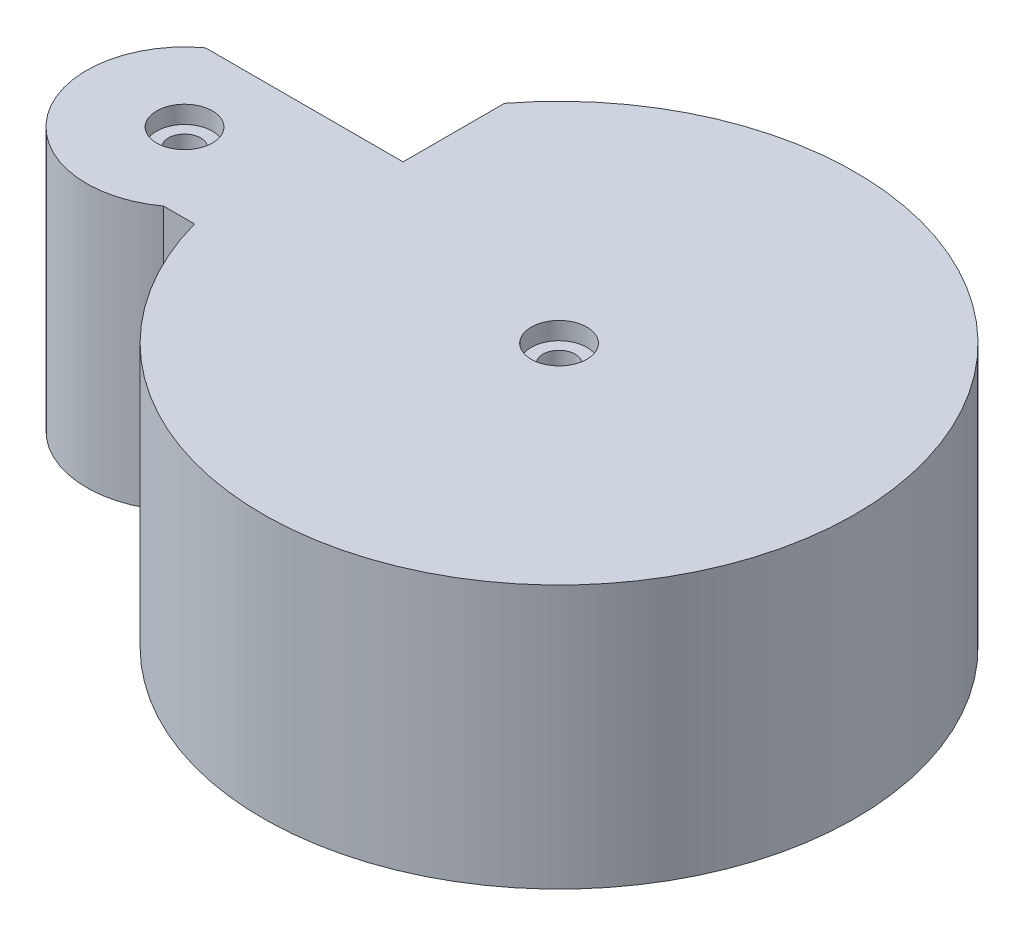
ISO-10303-21;
HEADER;
FILE_DESCRIPTION(('STEP AP214'),'2;1');
FILE_NAME('part.step','',(''),(''),'','','');
FILE_SCHEMA(('AUTOMOTIVE_DESIGN { 1 0 10303 214 1 1 1 1 }'));
ENDSEC;
DATA;
#1=APPLICATION_CONTEXT('core data for automotive mechanical design processes');
#2=APPLICATION_PROTOCOL_DEFINITION('international standard','automotive_design',2000,#1);
#3=PRODUCT_CONTEXT('',#1,'mechanical');
#4=PRODUCT('Part','Part','',(#3));
#5=PRODUCT_RELATED_PRODUCT_CATEGORY('part','',(#4));
#6=PRODUCT_DEFINITION_FORMATION('','',#4);
#7=PRODUCT_DEFINITION_CONTEXT('part definition',#1,'design');
#8=PRODUCT_DEFINITION('design','',#6,#7);
#9=PRODUCT_DEFINITION_SHAPE('','',#8);
#10=(LENGTH_UNIT() NAMED_UNIT(*) SI_UNIT(.MILLI.,.METRE.));
#11=(NAMED_UNIT(*) PLANE_ANGLE_UNIT() SI_UNIT($,.RADIAN.));
#12=(NAMED_UNIT(*) SI_UNIT($,.STERADIAN.) SOLID_ANGLE_UNIT());
#13=UNCERTAINTY_MEASURE_WITH_UNIT(LENGTH_MEASURE(1.E-05),#10,'distance_accuracy_value','');
#14=(GEOMETRIC_REPRESENTATION_CONTEXT(3) GLOBAL_UNCERTAINTY_ASSIGNED_CONTEXT((#13)) GLOBAL_UNIT_ASSIGNED_CONTEXT((#10,
#11,#12)) REPRESENTATION_CONTEXT('',''));
#15=CARTESIAN_POINT('',(0.,0.,0.));
#16=DIRECTION('',(0.,0.,1.));
#17=DIRECTION('',(1.,0.,0.));
#18=AXIS2_PLACEMENT_3D('',#15,#16,#17);
#19=CARTESIAN_POINT('',(-85.33,60.,0.));
#20=DIRECTION('',(0.,-1.,0.));
#21=DIRECTION('',(0.,0.,-1.));
#22=AXIS2_PLACEMENT_3D('',#19,#20,#21);
#23=CYLINDRICAL_SURFACE('',#22,3.675);
#24=CARTESIAN_POINT('',(-85.33,40.,0.));
#25=DIRECTION('',(0.,-1.,0.));
#26=DIRECTION('',(0.,0.,-1.));
#27=AXIS2_PLACEMENT_3D('',#24,#25,#26);
#28=CIRCLE('',#27,3.675);
#29=CARTESIAN_POINT('',(-85.33,40.,-3.675));
#30=VERTEX_POINT('',#29);
#31=EDGE_CURVE('E138',#30,#30,#28,.T.);
#32=ORIENTED_EDGE('',*,*,#31,.T.);
#33=EDGE_LOOP('',(#32));
#34=FACE_BOUND('',#33,.T.);
#35=CARTESIAN_POINT('',(-85.33,56.,0.));
#36=DIRECTION('',(0.,1.,0.));
#37=DIRECTION('',(0.,0.,1.));
#38=AXIS2_PLACEMENT_3D('',#35,#36,#37);
#39=CIRCLE('',#38,3.675);
#40=CARTESIAN_POINT('',(-85.33,56.,3.675));
#41=VERTEX_POINT('',#40);
#42=EDGE_CURVE('E45',#41,#41,#39,.T.);
#43=ORIENTED_EDGE('',*,*,#42,.T.);
#44=EDGE_LOOP('',(#43));
#45=FACE_BOUND('',#44,.T.);
#46=ADVANCED_FACE('F41',(#34,#45),#23,.F.);
#47=CARTESIAN_POINT('',(0.,60.,0.));
#48=DIRECTION('',(0.,-1.,0.));
#49=DIRECTION('',(0.,0.,-1.));
#50=AXIS2_PLACEMENT_3D('',#47,#48,#49);
#51=CYLINDRICAL_SURFACE('',#50,3.675);
#52=CARTESIAN_POINT('',(0.,4.,0.));
#53=DIRECTION('',(0.,-1.,0.));
#54=DIRECTION('',(0.,0.,-1.));
#55=AXIS2_PLACEMENT_3D('',#52,#53,#54);
#56=CIRCLE('',#55,3.675);
#57=CARTESIAN_POINT('',(0.,4.,-3.675));
#58=VERTEX_POINT('',#57);
#59=EDGE_CURVE('E161',#58,#58,#56,.T.);
#60=ORIENTED_EDGE('',*,*,#59,.T.);
#61=EDGE_LOOP('',(#60));
#62=FACE_BOUND('',#61,.T.);
#63=CARTESIAN_POINT('',(0.,56.,0.));
#64=DIRECTION('',(0.,1.,0.));
#65=DIRECTION('',(0.,0.,1.));
#66=AXIS2_PLACEMENT_3D('',#63,#64,#65);
#67=CIRCLE('',#66,3.675);
#68=CARTESIAN_POINT('',(0.,56.,3.675));
#69=VERTEX_POINT('',#68);
#70=EDGE_CURVE('E166',#69,#69,#67,.T.);
#71=ORIENTED_EDGE('',*,*,#70,.T.);
#72=EDGE_LOOP('',(#71));
#73=FACE_BOUND('',#72,.T.);
#74=ADVANCED_FACE('F270',(#62,#73),#51,.F.);
#75=CARTESIAN_POINT('',(0.,60.,18.));
#76=DIRECTION('',(0.,0.,1.));
#77=DIRECTION('',(1.,0.,0.));
#78=AXIS2_PLACEMENT_3D('',#75,#76,#77);
#79=PLANE('',#78);
#80=DIRECTION('',(-1.,0.,0.));
#81=VECTOR('',#80,1.);
#82=CARTESIAN_POINT('',(0.,0.,18.));
#83=LINE('',#82,#81);
#84=CARTESIAN_POINT('',(-65.0557453266043,0.,18.));
#85=VERTEX_POINT('',#84);
#86=CARTESIAN_POINT('',(-72.1152771500875,0.,18.));
#87=VERTEX_POINT('',#86);
#88=EDGE_CURVE('E133',#85,#87,#83,.T.);
#89=ORIENTED_EDGE('',*,*,#88,.F.);
#90=DIRECTION('',(0.,-1.,0.));
#91=VECTOR('',#90,1.);
#92=CARTESIAN_POINT('',(-65.0557453266043,60.,18.));
#93=LINE('',#92,#91);
#94=CARTESIAN_POINT('',(-65.0557453266043,60.,18.));
#95=VERTEX_POINT('',#94);
#96=EDGE_CURVE('E11',#95,#85,#93,.T.);
#97=ORIENTED_EDGE('',*,*,#96,.F.);
#98=DIRECTION('',(-1.,0.,0.));
#99=VECTOR('',#98,1.);
#100=CARTESIAN_POINT('',(0.,60.,18.));
#101=LINE('',#100,#99);
#102=CARTESIAN_POINT('',(-72.1152771500875,60.,18.));
#103=VERTEX_POINT('',#102);
#104=EDGE_CURVE('E150',#95,#103,#101,.T.);
#105=ORIENTED_EDGE('',*,*,#104,.T.);
#106=DIRECTION('',(0.,-1.,0.));
#107=VECTOR('',#106,1.);
#108=CARTESIAN_POINT('',(-72.1152771500875,60.,18.));
#109=LINE('',#108,#107);
#110=EDGE_CURVE('E92',#103,#87,#109,.T.);
#111=ORIENTED_EDGE('',*,*,#110,.T.);
#112=EDGE_LOOP('',(#89,#97,#105,#111));
#113=FACE_BOUND('',#112,.T.);
#114=ADVANCED_FACE('F43',(#113),#79,.T.);
#115=CARTESIAN_POINT('',(0.,60.,0.));
#116=DIRECTION('',(0.,-1.,0.));
#117=DIRECTION('',(0.,0.,-1.));
#118=AXIS2_PLACEMENT_3D('',#115,#116,#117);
#119=CYLINDRICAL_SURFACE('',#118,67.5);
#120=CARTESIAN_POINT('',(0.,0.,0.));
#121=DIRECTION('',(0.,1.,0.));
#122=DIRECTION('',(0.,0.,1.));
#123=AXIS2_PLACEMENT_3D('',#120,#121,#122);
#124=CIRCLE('',#123,67.5);
#125=CARTESIAN_POINT('',(-53.5447228499125,0.,-41.1000322983578));
#126=VERTEX_POINT('',#125);
#127=EDGE_CURVE('E137',#85,#126,#124,.T.);
#128=ORIENTED_EDGE('',*,*,#127,.T.);
#129=DIRECTION('',(0.,-1.,0.));
#130=VECTOR('',#129,1.);
#131=CARTESIAN_POINT('',(-53.5447228499125,60.,-41.1000322983578));
#132=LINE('',#131,#130);
#133=CARTESIAN_POINT('',(-53.5447228499125,60.,-41.1000322983578));
#134=VERTEX_POINT('',#133);
#135=EDGE_CURVE('E51',#134,#126,#132,.T.);
#136=ORIENTED_EDGE('',*,*,#135,.F.);
#137=CARTESIAN_POINT('',(0.,60.,0.));
#138=DIRECTION('',(0.,1.,0.));
#139=DIRECTION('',(0.,0.,1.));
#140=AXIS2_PLACEMENT_3D('',#137,#138,#139);
#141=CIRCLE('',#140,67.5);
#142=EDGE_CURVE('E122',#95,#134,#141,.T.);
#143=ORIENTED_EDGE('',*,*,#142,.F.);
#144=ORIENTED_EDGE('',*,*,#96,.T.);
#145=EDGE_LOOP('',(#128,#136,#143,#144));
#146=FACE_BOUND('',#145,.T.);
#147=ADVANCED_FACE('F269',(#146),#119,.T.);
#148=CARTESIAN_POINT('',(-53.5447228499125,60.,0.));
#149=DIRECTION('',(-1.,0.,0.));
#150=DIRECTION('',(0.,0.,1.));
#151=AXIS2_PLACEMENT_3D('',#148,#149,#150);
#152=PLANE('',#151);
#153=DIRECTION('',(0.,0.,-1.));
#154=VECTOR('',#153,1.);
#155=CARTESIAN_POINT('',(-53.5447228499125,0.,0.));
#156=LINE('',#155,#154);
#157=CARTESIAN_POINT('',(-53.5447228499125,0.,-18.));
#158=VERTEX_POINT('',#157);
#159=EDGE_CURVE('E112',#158,#126,#156,.T.);
#160=ORIENTED_EDGE('',*,*,#159,.F.);
#161=DIRECTION('',(0.,-1.,0.));
#162=VECTOR('',#161,1.);
#163=CARTESIAN_POINT('',(-53.5447228499125,60.,-18.));
#164=LINE('',#163,#162);
#165=CARTESIAN_POINT('',(-53.5447228499125,60.,-18.));
#166=VERTEX_POINT('',#165);
#167=EDGE_CURVE('E107',#166,#158,#164,.T.);
#168=ORIENTED_EDGE('',*,*,#167,.F.);
#169=DIRECTION('',(0.,0.,-1.));
#170=VECTOR('',#169,1.);
#171=CARTESIAN_POINT('',(-53.5447228499125,60.,0.));
#172=LINE('',#171,#170);
#173=EDGE_CURVE('E110',#166,#134,#172,.T.);
#174=ORIENTED_EDGE('',*,*,#173,.T.);
#175=ORIENTED_EDGE('',*,*,#135,.T.);
#176=EDGE_LOOP('',(#160,#168,#174,#175));
#177=FACE_BOUND('',#176,.T.);
#178=ADVANCED_FACE('F109',(#177),#152,.T.);
#179=CARTESIAN_POINT('',(0.,60.,-18.));
#180=DIRECTION('',(0.,0.,-1.));
#181=DIRECTION('',(-1.,0.,0.));
#182=AXIS2_PLACEMENT_3D('',#179,#180,#181);
#183=PLANE('',#182);
#184=CARTESIAN_POINT('',(-57.33,24.6,-18.));
#185=DIRECTION('',(0.,0.,-1.));
#186=DIRECTION('',(-1.,0.,0.));
#187=AXIS2_PLACEMENT_3D('',#184,#185,#186);
#188=CIRCLE('',#187,1.29999999999999);
#189=CARTESIAN_POINT('',(-58.63,24.6,-18.));
#190=VERTEX_POINT('',#189);
#191=EDGE_CURVE('E164',#190,#190,#188,.T.);
#192=ORIENTED_EDGE('',*,*,#191,.F.);
#193=EDGE_LOOP('',(#192));
#194=FACE_BOUND('',#193,.T.);
#195=CARTESIAN_POINT('',(-81.33,24.6,-18.));
#196=DIRECTION('',(0.,0.,-1.));
#197=DIRECTION('',(-1.,0.,0.));
#198=AXIS2_PLACEMENT_3D('',#195,#196,#197);
#199=CIRCLE('',#198,1.29999999999998);
#200=CARTESIAN_POINT('',(-82.63,24.6,-18.));
#201=VERTEX_POINT('',#200);
#202=EDGE_CURVE('E199',#201,#201,#199,.T.);
#203=ORIENTED_EDGE('',*,*,#202,.F.);
#204=EDGE_LOOP('',(#203));
#205=FACE_BOUND('',#204,.T.);
#206=CARTESIAN_POINT('',(-81.33,12.6,-18.));
#207=DIRECTION('',(0.,0.,-1.));
#208=DIRECTION('',(-1.,0.,0.));
#209=AXIS2_PLACEMENT_3D('',#206,#207,#208);
#210=CIRCLE('',#209,1.29999999999998);
#211=CARTESIAN_POINT('',(-82.63,12.6,-18.));
#212=VERTEX_POINT('',#211);
#213=EDGE_CURVE('E207',#212,#212,#210,.T.);
#214=ORIENTED_EDGE('',*,*,#213,.F.);
#215=EDGE_LOOP('',(#214));
#216=FACE_BOUND('',#215,.T.);
#217=CARTESIAN_POINT('',(-57.33,12.6,-18.));
#218=DIRECTION('',(0.,0.,-1.));
#219=DIRECTION('',(-1.,0.,0.));
#220=AXIS2_PLACEMENT_3D('',#217,#218,#219);
#221=CIRCLE('',#220,1.29999999999999);
#222=CARTESIAN_POINT('',(-58.63,12.6,-18.));
#223=VERTEX_POINT('',#222);
#224=EDGE_CURVE('E215',#223,#223,#221,.T.);
#225=ORIENTED_EDGE('',*,*,#224,.F.);
#226=EDGE_LOOP('',(#225));
#227=FACE_BOUND('',#226,.T.);
#228=DIRECTION('',(1.,0.,0.));
#229=VECTOR('',#228,1.);
#230=CARTESIAN_POINT('',(0.,0.,-18.));
#231=LINE('',#230,#229);
#232=CARTESIAN_POINT('',(-98.5447228499125,0.,-18.));
#233=VERTEX_POINT('',#232);
#234=EDGE_CURVE('E144',#233,#158,#231,.T.);
#235=ORIENTED_EDGE('',*,*,#234,.F.);
#236=DIRECTION('',(0.,-1.,0.));
#237=VECTOR('',#236,1.);
#238=CARTESIAN_POINT('',(-98.5447228499125,60.,-18.));
#239=LINE('',#238,#237);
#240=CARTESIAN_POINT('',(-98.5447228499125,60.,-18.));
#241=VERTEX_POINT('',#240);
#242=EDGE_CURVE('E118',#241,#233,#239,.T.);
#243=ORIENTED_EDGE('',*,*,#242,.F.);
#244=DIRECTION('',(1.,0.,0.));
#245=VECTOR('',#244,1.);
#246=CARTESIAN_POINT('',(0.,60.,-18.));
#247=LINE('',#246,#245);
#248=EDGE_CURVE('E121',#241,#166,#247,.T.);
#249=ORIENTED_EDGE('',*,*,#248,.T.);
#250=ORIENTED_EDGE('',*,*,#167,.T.);
#251=EDGE_LOOP('',(#235,#243,#249,#250));
#252=FACE_BOUND('',#251,.T.);
#253=ADVANCED_FACE('F126',(#194,#205,#216,#227,#252),#183,.T.);
#254=CARTESIAN_POINT('',(-85.33,60.,0.));
#255=DIRECTION('',(0.,-1.,0.));
#256=DIRECTION('',(0.,0.,-1.));
#257=AXIS2_PLACEMENT_3D('',#254,#255,#256);
#258=CYLINDRICAL_SURFACE('',#257,22.33);
#259=CARTESIAN_POINT('',(-85.33,0.,0.));
#260=DIRECTION('',(0.,1.,0.));
#261=DIRECTION('',(0.,0.,1.));
#262=AXIS2_PLACEMENT_3D('',#259,#260,#261);
#263=CIRCLE('',#262,22.33);
#264=EDGE_CURVE('E147',#233,#87,#263,.T.);
#265=ORIENTED_EDGE('',*,*,#264,.T.);
#266=ORIENTED_EDGE('',*,*,#110,.F.);
#267=CARTESIAN_POINT('',(-85.33,60.,0.));
#268=DIRECTION('',(0.,1.,0.));
#269=DIRECTION('',(0.,0.,1.));
#270=AXIS2_PLACEMENT_3D('',#267,#268,#269);
#271=CIRCLE('',#270,22.33);
#272=EDGE_CURVE('E68',#241,#103,#271,.T.);
#273=ORIENTED_EDGE('',*,*,#272,.F.);
#274=ORIENTED_EDGE('',*,*,#242,.T.);
#275=EDGE_LOOP('',(#265,#266,#273,#274));
#276=FACE_BOUND('',#275,.T.);
#277=ADVANCED_FACE('F286',(#276),#258,.T.);
#278=CARTESIAN_POINT('',(0.,60.,0.));
#279=DIRECTION('',(0.,1.,0.));
#280=DIRECTION('',(0.,0.,1.));
#281=AXIS2_PLACEMENT_3D('',#278,#279,#280);
#282=PLANE('',#281);
#283=CARTESIAN_POINT('',(-85.33,60.,0.));
#284=DIRECTION('',(0.,1.,0.));
#285=DIRECTION('',(0.,0.,1.));
#286=AXIS2_PLACEMENT_3D('',#283,#284,#285);
#287=CIRCLE('',#286,6.35);
#288=CARTESIAN_POINT('',(-85.33,60.,6.35));
#289=VERTEX_POINT('',#288);
#290=EDGE_CURVE('E186',#289,#289,#287,.T.);
#291=ORIENTED_EDGE('',*,*,#290,.F.);
#292=EDGE_LOOP('',(#291));
#293=FACE_BOUND('',#292,.T.);
#294=CARTESIAN_POINT('',(0.,60.,0.));
#295=DIRECTION('',(0.,1.,0.));
#296=DIRECTION('',(0.,0.,1.));
#297=AXIS2_PLACEMENT_3D('',#294,#295,#296);
#298=CIRCLE('',#297,6.35);
#299=CARTESIAN_POINT('',(0.,60.,6.35));
#300=VERTEX_POINT('',#299);
#301=EDGE_CURVE('E178',#300,#300,#298,.T.);
#302=ORIENTED_EDGE('',*,*,#301,.F.);
#303=EDGE_LOOP('',(#302));
#304=FACE_BOUND('',#303,.T.);
#305=ORIENTED_EDGE('',*,*,#104,.F.);
#306=ORIENTED_EDGE('',*,*,#142,.T.);
#307=ORIENTED_EDGE('',*,*,#173,.F.);
#308=ORIENTED_EDGE('',*,*,#248,.F.);
#309=ORIENTED_EDGE('',*,*,#272,.T.);
#310=EDGE_LOOP('',(#305,#306,#307,#308,#309));
#311=FACE_BOUND('',#310,.T.);
#312=ADVANCED_FACE('F120',(#293,#304,#311),#282,.T.);
#313=CARTESIAN_POINT('',(0.,0.,0.));
#314=DIRECTION('',(0.,1.,0.));
#315=DIRECTION('',(0.,0.,1.));
#316=AXIS2_PLACEMENT_3D('',#313,#314,#315);
#317=PLANE('',#316);
#318=CARTESIAN_POINT('',(0.,0.,0.));
#319=DIRECTION('',(0.,-1.,0.));
#320=DIRECTION('',(0.,0.,-1.));
#321=AXIS2_PLACEMENT_3D('',#318,#319,#320);
#322=CIRCLE('',#321,6.35);
#323=CARTESIAN_POINT('',(0.,0.,-6.35));
#324=VERTEX_POINT('',#323);
#325=EDGE_CURVE('E169',#324,#324,#322,.T.);
#326=ORIENTED_EDGE('',*,*,#325,.F.);
#327=EDGE_LOOP('',(#326));
#328=FACE_BOUND('',#327,.T.);
#329=DIRECTION('',(1.,0.,0.));
#330=VECTOR('',#329,1.);
#331=CARTESIAN_POINT('',(-96.58,0.,-14.5));
#332=LINE('',#331,#330);
#333=CARTESIAN_POINT('',(-96.58,0.,-14.5));
#334=VERTEX_POINT('',#333);
#335=CARTESIAN_POINT('',(-46.58,0.,-14.5));
#336=VERTEX_POINT('',#335);
#337=EDGE_CURVE('E243',#334,#336,#332,.T.);
#338=ORIENTED_EDGE('',*,*,#337,.F.);
#339=DIRECTION('',(0.,0.,-1.));
#340=VECTOR('',#339,1.);
#341=CARTESIAN_POINT('',(-96.58,0.,14.5));
#342=LINE('',#341,#340);
#343=CARTESIAN_POINT('',(-96.58,0.,14.5));
#344=VERTEX_POINT('',#343);
#345=EDGE_CURVE('E59',#344,#334,#342,.T.);
#346=ORIENTED_EDGE('',*,*,#345,.F.);
#347=DIRECTION('',(-1.,0.,0.));
#348=VECTOR('',#347,1.);
#349=CARTESIAN_POINT('',(-96.58,0.,14.5));
#350=LINE('',#349,#348);
#351=CARTESIAN_POINT('',(-46.58,0.,14.5));
#352=VERTEX_POINT('',#351);
#353=EDGE_CURVE('E228',#352,#344,#350,.T.);
#354=ORIENTED_EDGE('',*,*,#353,.F.);
#355=DIRECTION('',(0.,0.,1.));
#356=VECTOR('',#355,1.);
#357=CARTESIAN_POINT('',(-46.58,0.,14.5));
#358=LINE('',#357,#356);
#359=EDGE_CURVE('E247',#336,#352,#358,.T.);
#360=ORIENTED_EDGE('',*,*,#359,.F.);
#361=EDGE_LOOP('',(#338,#346,#354,#360));
#362=FACE_BOUND('',#361,.T.);
#363=ORIENTED_EDGE('',*,*,#88,.T.);
#364=ORIENTED_EDGE('',*,*,#264,.F.);
#365=ORIENTED_EDGE('',*,*,#234,.T.);
#366=ORIENTED_EDGE('',*,*,#159,.T.);
#367=ORIENTED_EDGE('',*,*,#127,.F.);
#368=EDGE_LOOP('',(#363,#364,#365,#366,#367));
#369=FACE_BOUND('',#368,.T.);
#370=ADVANCED_FACE('F315',(#328,#362,#369),#317,.F.);
#371=CARTESIAN_POINT('',(-96.58,40.,14.5));
#372=DIRECTION('',(-1.,0.,0.));
#373=DIRECTION('',(0.,0.,1.));
#374=AXIS2_PLACEMENT_3D('',#371,#372,#373);
#375=PLANE('',#374);
#376=ORIENTED_EDGE('',*,*,#345,.T.);
#377=DIRECTION('',(0.,-1.,0.));
#378=VECTOR('',#377,1.);
#379=CARTESIAN_POINT('',(-96.58,40.,-14.5));
#380=LINE('',#379,#378);
#381=CARTESIAN_POINT('',(-96.58,40.,-14.5));
#382=VERTEX_POINT('',#381);
#383=EDGE_CURVE('E240',#382,#334,#380,.T.);
#384=ORIENTED_EDGE('',*,*,#383,.F.);
#385=DIRECTION('',(0.,0.,-1.));
#386=VECTOR('',#385,1.);
#387=CARTESIAN_POINT('',(-96.58,40.,14.5));
#388=LINE('',#387,#386);
#389=CARTESIAN_POINT('',(-96.58,40.,14.5));
#390=VERTEX_POINT('',#389);
#391=EDGE_CURVE('E223',#390,#382,#388,.T.);
#392=ORIENTED_EDGE('',*,*,#391,.F.);
#393=DIRECTION('',(0.,-1.,0.));
#394=VECTOR('',#393,1.);
#395=CARTESIAN_POINT('',(-96.58,40.,14.5));
#396=LINE('',#395,#394);
#397=EDGE_CURVE('E160',#390,#344,#396,.T.);
#398=ORIENTED_EDGE('',*,*,#397,.T.);
#399=EDGE_LOOP('',(#376,#384,#392,#398));
#400=FACE_BOUND('',#399,.T.);
#401=ADVANCED_FACE('F324',(#400),#375,.F.);
#402=CARTESIAN_POINT('',(-96.58,40.,14.5));
#403=DIRECTION('',(0.,0.,1.));
#404=DIRECTION('',(1.,0.,0.));
#405=AXIS2_PLACEMENT_3D('',#402,#403,#404);
#406=PLANE('',#405);
#407=ORIENTED_EDGE('',*,*,#353,.T.);
#408=ORIENTED_EDGE('',*,*,#397,.F.);
#409=DIRECTION('',(-1.,0.,0.));
#410=VECTOR('',#409,1.);
#411=CARTESIAN_POINT('',(-96.58,40.,14.5));
#412=LINE('',#411,#410);
#413=CARTESIAN_POINT('',(-46.58,40.,14.5));
#414=VERTEX_POINT('',#413);
#415=EDGE_CURVE('E236',#414,#390,#412,.T.);
#416=ORIENTED_EDGE('',*,*,#415,.F.);
#417=DIRECTION('',(0.,-1.,0.));
#418=VECTOR('',#417,1.);
#419=CARTESIAN_POINT('',(-46.58,40.,14.5));
#420=LINE('',#419,#418);
#421=EDGE_CURVE('E256',#414,#352,#420,.T.);
#422=ORIENTED_EDGE('',*,*,#421,.T.);
#423=EDGE_LOOP('',(#407,#408,#416,#422));
#424=FACE_BOUND('',#423,.T.);
#425=ADVANCED_FACE('F332',(#424),#406,.F.);
#426=CARTESIAN_POINT('',(-46.58,40.,14.5));
#427=DIRECTION('',(1.,0.,0.));
#428=DIRECTION('',(0.,0.,-1.));
#429=AXIS2_PLACEMENT_3D('',#426,#427,#428);
#430=PLANE('',#429);
#431=ORIENTED_EDGE('',*,*,#359,.T.);
#432=ORIENTED_EDGE('',*,*,#421,.F.);
#433=DIRECTION('',(0.,0.,1.));
#434=VECTOR('',#433,1.);
#435=CARTESIAN_POINT('',(-46.58,40.,14.5));
#436=LINE('',#435,#434);
#437=CARTESIAN_POINT('',(-46.58,40.,-14.5));
#438=VERTEX_POINT('',#437);
#439=EDGE_CURVE('E232',#438,#414,#436,.T.);
#440=ORIENTED_EDGE('',*,*,#439,.F.);
#441=DIRECTION('',(0.,-1.,0.));
#442=VECTOR('',#441,1.);
#443=CARTESIAN_POINT('',(-46.58,40.,-14.5));
#444=LINE('',#443,#442);
#445=EDGE_CURVE('E260',#438,#336,#444,.T.);
#446=ORIENTED_EDGE('',*,*,#445,.T.);
#447=EDGE_LOOP('',(#431,#432,#440,#446));
#448=FACE_BOUND('',#447,.T.);
#449=ADVANCED_FACE('F339',(#448),#430,.F.);
#450=CARTESIAN_POINT('',(-96.58,40.,-14.5));
#451=DIRECTION('',(0.,0.,-1.));
#452=DIRECTION('',(-1.,0.,0.));
#453=AXIS2_PLACEMENT_3D('',#450,#451,#452);
#454=PLANE('',#453);
#455=CARTESIAN_POINT('',(-57.33,24.6,-14.5));
#456=DIRECTION('',(0.,0.,-1.));
#457=DIRECTION('',(-1.,0.,0.));
#458=AXIS2_PLACEMENT_3D('',#455,#456,#457);
#459=CIRCLE('',#458,1.3);
#460=CARTESIAN_POINT('',(-58.63,24.6,-14.5));
#461=VERTEX_POINT('',#460);
#462=EDGE_CURVE('E195',#461,#461,#459,.T.);
#463=ORIENTED_EDGE('',*,*,#462,.T.);
#464=EDGE_LOOP('',(#463));
#465=FACE_BOUND('',#464,.T.);
#466=CARTESIAN_POINT('',(-81.33,24.6,-14.5));
#467=DIRECTION('',(0.,0.,-1.));
#468=DIRECTION('',(-1.,0.,0.));
#469=AXIS2_PLACEMENT_3D('',#466,#467,#468);
#470=CIRCLE('',#469,1.29999999999999);
#471=CARTESIAN_POINT('',(-82.63,24.6,-14.5));
#472=VERTEX_POINT('',#471);
#473=EDGE_CURVE('E203',#472,#472,#470,.T.);
#474=ORIENTED_EDGE('',*,*,#473,.T.);
#475=EDGE_LOOP('',(#474));
#476=FACE_BOUND('',#475,.T.);
#477=CARTESIAN_POINT('',(-81.33,12.6,-14.5));
#478=DIRECTION('',(0.,0.,-1.));
#479=DIRECTION('',(-1.,0.,0.));
#480=AXIS2_PLACEMENT_3D('',#477,#478,#479);
#481=CIRCLE('',#480,1.29999999999999);
#482=CARTESIAN_POINT('',(-82.63,12.6,-14.5));
#483=VERTEX_POINT('',#482);
#484=EDGE_CURVE('E211',#483,#483,#481,.T.);
#485=ORIENTED_EDGE('',*,*,#484,.T.);
#486=EDGE_LOOP('',(#485));
#487=FACE_BOUND('',#486,.T.);
#488=CARTESIAN_POINT('',(-57.33,12.6,-14.5));
#489=DIRECTION('',(0.,0.,-1.));
#490=DIRECTION('',(-1.,0.,0.));
#491=AXIS2_PLACEMENT_3D('',#488,#489,#490);
#492=CIRCLE('',#491,1.3);
#493=CARTESIAN_POINT('',(-58.63,12.6,-14.5));
#494=VERTEX_POINT('',#493);
#495=EDGE_CURVE('E219',#494,#494,#492,.T.);
#496=ORIENTED_EDGE('',*,*,#495,.T.);
#497=EDGE_LOOP('',(#496));
#498=FACE_BOUND('',#497,.T.);
#499=ORIENTED_EDGE('',*,*,#337,.T.);
#500=ORIENTED_EDGE('',*,*,#445,.F.);
#501=DIRECTION('',(1.,0.,0.));
#502=VECTOR('',#501,1.);
#503=CARTESIAN_POINT('',(-96.58,40.,-14.5));
#504=LINE('',#503,#502);
#505=EDGE_CURVE('E227',#382,#438,#504,.T.);
#506=ORIENTED_EDGE('',*,*,#505,.F.);
#507=ORIENTED_EDGE('',*,*,#383,.T.);
#508=EDGE_LOOP('',(#499,#500,#506,#507));
#509=FACE_BOUND('',#508,.T.);
#510=ADVANCED_FACE('F347',(#465,#476,#487,#498,#509),#454,.F.);
#511=CARTESIAN_POINT('',(0.,40.,0.));
#512=DIRECTION('',(0.,-1.,0.));
#513=DIRECTION('',(0.,0.,-1.));
#514=AXIS2_PLACEMENT_3D('',#511,#512,#513);
#515=PLANE('',#514);
#516=ORIENTED_EDGE('',*,*,#31,.F.);
#517=EDGE_LOOP('',(#516));
#518=FACE_BOUND('',#517,.T.);
#519=ORIENTED_EDGE('',*,*,#391,.T.);
#520=ORIENTED_EDGE('',*,*,#505,.T.);
#521=ORIENTED_EDGE('',*,*,#439,.T.);
#522=ORIENTED_EDGE('',*,*,#415,.T.);
#523=EDGE_LOOP('',(#519,#520,#521,#522));
#524=FACE_BOUND('',#523,.T.);
#525=ADVANCED_FACE('F354',(#518,#524),#515,.T.);
#526=CARTESIAN_POINT('',(-57.33,12.6,-18.));
#527=DIRECTION('',(0.,0.,-1.));
#528=DIRECTION('',(-1.,0.,0.));
#529=AXIS2_PLACEMENT_3D('',#526,#527,#528);
#530=CYLINDRICAL_SURFACE('',#529,1.3);
#531=ORIENTED_EDGE('',*,*,#495,.F.);
#532=EDGE_LOOP('',(#531));
#533=FACE_BOUND('',#532,.T.);
#534=ORIENTED_EDGE('',*,*,#224,.T.);
#535=EDGE_LOOP('',(#534));
#536=FACE_BOUND('',#535,.T.);
#537=ADVANCED_FACE('F362',(#533,#536),#530,.F.);
#538=CARTESIAN_POINT('',(-81.33,12.6,-18.));
#539=DIRECTION('',(0.,0.,-1.));
#540=DIRECTION('',(-1.,0.,0.));
#541=AXIS2_PLACEMENT_3D('',#538,#539,#540);
#542=CYLINDRICAL_SURFACE('',#541,1.29999999999999);
#543=ORIENTED_EDGE('',*,*,#484,.F.);
#544=EDGE_LOOP('',(#543));
#545=FACE_BOUND('',#544,.T.);
#546=ORIENTED_EDGE('',*,*,#213,.T.);
#547=EDGE_LOOP('',(#546));
#548=FACE_BOUND('',#547,.T.);
#549=ADVANCED_FACE('F369',(#545,#548),#542,.F.);
#550=CARTESIAN_POINT('',(-81.33,24.6,-18.));
#551=DIRECTION('',(0.,0.,-1.));
#552=DIRECTION('',(-1.,0.,0.));
#553=AXIS2_PLACEMENT_3D('',#550,#551,#552);
#554=CYLINDRICAL_SURFACE('',#553,1.29999999999999);
#555=ORIENTED_EDGE('',*,*,#473,.F.);
#556=EDGE_LOOP('',(#555));
#557=FACE_BOUND('',#556,.T.);
#558=ORIENTED_EDGE('',*,*,#202,.T.);
#559=EDGE_LOOP('',(#558));
#560=FACE_BOUND('',#559,.T.);
#561=ADVANCED_FACE('F377',(#557,#560),#554,.F.);
#562=CARTESIAN_POINT('',(-57.33,24.6,-18.));
#563=DIRECTION('',(0.,0.,-1.));
#564=DIRECTION('',(-1.,0.,0.));
#565=AXIS2_PLACEMENT_3D('',#562,#563,#564);
#566=CYLINDRICAL_SURFACE('',#565,1.3);
#567=ORIENTED_EDGE('',*,*,#462,.F.);
#568=EDGE_LOOP('',(#567));
#569=FACE_BOUND('',#568,.T.);
#570=ORIENTED_EDGE('',*,*,#191,.T.);
#571=EDGE_LOOP('',(#570));
#572=FACE_BOUND('',#571,.T.);
#573=ADVANCED_FACE('F385',(#569,#572),#566,.F.);
#574=CARTESIAN_POINT('',(0.,4.,0.));
#575=DIRECTION('',(0.,-1.,0.));
#576=DIRECTION('',(0.,0.,-1.));
#577=AXIS2_PLACEMENT_3D('',#574,#575,#576);
#578=CYLINDRICAL_SURFACE('',#577,6.35);
#579=CARTESIAN_POINT('',(0.,4.,0.));
#580=DIRECTION('',(0.,-1.,0.));
#581=DIRECTION('',(0.,0.,-1.));
#582=AXIS2_PLACEMENT_3D('',#579,#580,#581);
#583=CIRCLE('',#582,6.35);
#584=CARTESIAN_POINT('',(0.,4.,-6.35));
#585=VERTEX_POINT('',#584);
#586=EDGE_CURVE('E165',#585,#585,#583,.T.);
#587=ORIENTED_EDGE('',*,*,#586,.F.);
#588=EDGE_LOOP('',(#587));
#589=FACE_BOUND('',#588,.T.);
#590=ORIENTED_EDGE('',*,*,#325,.T.);
#591=EDGE_LOOP('',(#590));
#592=FACE_BOUND('',#591,.T.);
#593=ADVANCED_FACE('F392',(#589,#592),#578,.F.);
#594=CARTESIAN_POINT('',(0.,4.,0.));
#595=DIRECTION('',(0.,-1.,0.));
#596=DIRECTION('',(0.,0.,-1.));
#597=AXIS2_PLACEMENT_3D('',#594,#595,#596);
#598=PLANE('',#597);
#599=ORIENTED_EDGE('',*,*,#59,.F.);
#600=EDGE_LOOP('',(#599));
#601=FACE_BOUND('',#600,.T.);
#602=ORIENTED_EDGE('',*,*,#586,.T.);
#603=EDGE_LOOP('',(#602));
#604=FACE_BOUND('',#603,.T.);
#605=ADVANCED_FACE('F399',(#601,#604),#598,.T.);
#606=CARTESIAN_POINT('',(0.,56.,0.));
#607=DIRECTION('',(0.,1.,0.));
#608=DIRECTION('',(0.,0.,1.));
#609=AXIS2_PLACEMENT_3D('',#606,#607,#608);
#610=CYLINDRICAL_SURFACE('',#609,6.35);
#611=CARTESIAN_POINT('',(0.,56.,0.));
#612=DIRECTION('',(0.,1.,0.));
#613=DIRECTION('',(0.,0.,1.));
#614=AXIS2_PLACEMENT_3D('',#611,#612,#613);
#615=CIRCLE('',#614,6.35);
#616=CARTESIAN_POINT('',(0.,56.,6.35));
#617=VERTEX_POINT('',#616);
#618=EDGE_CURVE('E170',#617,#617,#615,.T.);
#619=ORIENTED_EDGE('',*,*,#618,.F.);
#620=EDGE_LOOP('',(#619));
#621=FACE_BOUND('',#620,.T.);
#622=ORIENTED_EDGE('',*,*,#301,.T.);
#623=EDGE_LOOP('',(#622));
#624=FACE_BOUND('',#623,.T.);
#625=ADVANCED_FACE('F407',(#621,#624),#610,.F.);
#626=CARTESIAN_POINT('',(0.,56.,0.));
#627=DIRECTION('',(0.,1.,0.));
#628=DIRECTION('',(0.,0.,1.));
#629=AXIS2_PLACEMENT_3D('',#626,#627,#628);
#630=PLANE('',#629);
#631=ORIENTED_EDGE('',*,*,#70,.F.);
#632=EDGE_LOOP('',(#631));
#633=FACE_BOUND('',#632,.T.);
#634=ORIENTED_EDGE('',*,*,#618,.T.);
#635=EDGE_LOOP('',(#634));
#636=FACE_BOUND('',#635,.T.);
#637=ADVANCED_FACE('F416',(#633,#636),#630,.T.);
#638=CARTESIAN_POINT('',(-85.33,56.,0.));
#639=DIRECTION('',(0.,1.,0.));
#640=DIRECTION('',(0.,0.,1.));
#641=AXIS2_PLACEMENT_3D('',#638,#639,#640);
#642=CYLINDRICAL_SURFACE('',#641,6.35);
#643=CARTESIAN_POINT('',(-85.33,56.,0.));
#644=DIRECTION('',(0.,1.,0.));
#645=DIRECTION('',(0.,0.,1.));
#646=AXIS2_PLACEMENT_3D('',#643,#644,#645);
#647=CIRCLE('',#646,6.35);
#648=CARTESIAN_POINT('',(-85.33,56.,6.35));
#649=VERTEX_POINT('',#648);
#650=EDGE_CURVE('E522',#649,#649,#647,.T.);
#651=ORIENTED_EDGE('',*,*,#650,.F.);
#652=EDGE_LOOP('',(#651));
#653=FACE_BOUND('',#652,.T.);
#654=ORIENTED_EDGE('',*,*,#290,.T.);
#655=EDGE_LOOP('',(#654));
#656=FACE_BOUND('',#655,.T.);
#657=ADVANCED_FACE('F424',(#653,#656),#642,.F.);
#658=CARTESIAN_POINT('',(-85.33,56.,0.));
#659=DIRECTION('',(0.,1.,0.));
#660=DIRECTION('',(0.,0.,1.));
#661=AXIS2_PLACEMENT_3D('',#658,#659,#660);
#662=PLANE('',#661);
#663=ORIENTED_EDGE('',*,*,#42,.F.);
#664=EDGE_LOOP('',(#663));
#665=FACE_BOUND('',#664,.T.);
#666=ORIENTED_EDGE('',*,*,#650,.T.);
#667=EDGE_LOOP('',(#666));
#668=FACE_BOUND('',#667,.T.);
#669=ADVANCED_FACE('F431',(#665,#668),#662,.T.);
#670=CLOSED_SHELL('',(#46,#74,#114,#147,#178,#253,#277,#312,#370,#401,#425,#449,#510,#525,#537,
#549,#561,#573,#593,#605,#625,#637,#657,#669));
#671=MANIFOLD_SOLID_BREP('B2',#670);
#672=ADVANCED_BREP_SHAPE_REPRESENTATION('',(#18,#671),#14);
#673=SHAPE_DEFINITION_REPRESENTATION(#9,#672);
ENDSEC;
END-ISO-10303-21;
